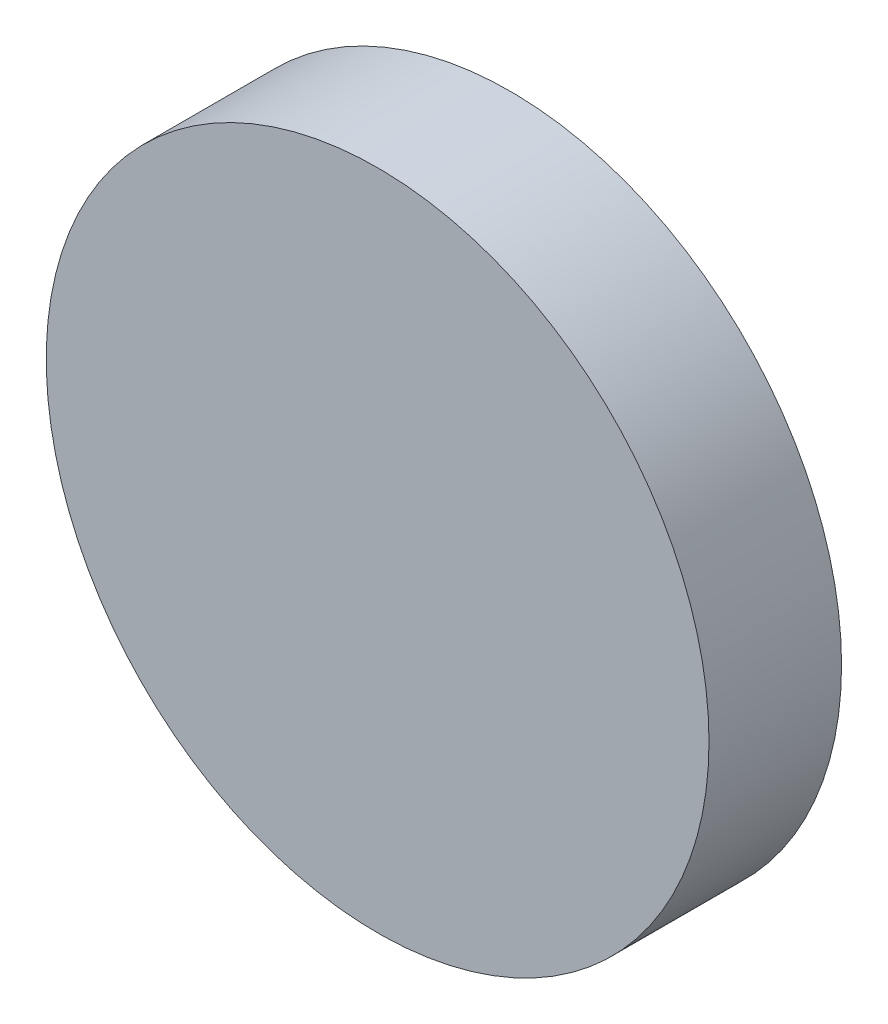
ISO-10303-21;
HEADER;
FILE_DESCRIPTION(('STEP AP214'),'2;1');
FILE_NAME('part.step','',(''),(''),'','','');
FILE_SCHEMA(('AUTOMOTIVE_DESIGN { 1 0 10303 214 1 1 1 1 }'));
ENDSEC;
DATA;
#1=APPLICATION_CONTEXT('core data for automotive mechanical design processes');
#2=APPLICATION_PROTOCOL_DEFINITION('international standard','automotive_design',2000,#1);
#3=PRODUCT_CONTEXT('',#1,'mechanical');
#4=PRODUCT('Part','Part','',(#3));
#5=PRODUCT_RELATED_PRODUCT_CATEGORY('part','',(#4));
#6=PRODUCT_DEFINITION_FORMATION('','',#4);
#7=PRODUCT_DEFINITION_CONTEXT('part definition',#1,'design');
#8=PRODUCT_DEFINITION('design','',#6,#7);
#9=PRODUCT_DEFINITION_SHAPE('','',#8);
#10=(LENGTH_UNIT() NAMED_UNIT(*) SI_UNIT(.MILLI.,.METRE.));
#11=(NAMED_UNIT(*) PLANE_ANGLE_UNIT() SI_UNIT($,.RADIAN.));
#12=(NAMED_UNIT(*) SI_UNIT($,.STERADIAN.) SOLID_ANGLE_UNIT());
#13=UNCERTAINTY_MEASURE_WITH_UNIT(LENGTH_MEASURE(1.E-05),#10,'distance_accuracy_value','');
#14=(GEOMETRIC_REPRESENTATION_CONTEXT(3) GLOBAL_UNCERTAINTY_ASSIGNED_CONTEXT((#13)) GLOBAL_UNIT_ASSIGNED_CONTEXT((#10,
#11,#12)) REPRESENTATION_CONTEXT('',''));
#15=CARTESIAN_POINT('',(0.,0.,0.));
#16=DIRECTION('',(0.,0.,1.));
#17=DIRECTION('',(1.,0.,0.));
#18=AXIS2_PLACEMENT_3D('',#15,#16,#17);
#19=CARTESIAN_POINT('',(0.,0.,20.));
#20=DIRECTION('',(0.,0.,-1.));
#21=DIRECTION('',(-1.,0.,0.));
#22=AXIS2_PLACEMENT_3D('',#19,#20,#21);
#23=CYLINDRICAL_SURFACE('',#22,50.);
#24=CARTESIAN_POINT('',(0.,0.,20.));
#25=DIRECTION('',(0.,0.,1.));
#26=DIRECTION('',(1.,0.,0.));
#27=AXIS2_PLACEMENT_3D('',#24,#25,#26);
#28=CIRCLE('',#27,50.);
#29=CARTESIAN_POINT('',(50.,0.,20.));
#30=VERTEX_POINT('',#29);
#31=EDGE_CURVE('E10',#30,#30,#28,.T.);
#32=ORIENTED_EDGE('',*,*,#31,.F.);
#33=EDGE_LOOP('',(#32));
#34=FACE_BOUND('',#33,.T.);
#35=CARTESIAN_POINT('',(0.,0.,0.));
#36=DIRECTION('',(0.,0.,1.));
#37=DIRECTION('',(1.,0.,0.));
#38=AXIS2_PLACEMENT_3D('',#35,#36,#37);
#39=CIRCLE('',#38,50.);
#40=CARTESIAN_POINT('',(50.,0.,0.));
#41=VERTEX_POINT('',#40);
#42=EDGE_CURVE('E34',#41,#41,#39,.T.);
#43=ORIENTED_EDGE('',*,*,#42,.T.);
#44=EDGE_LOOP('',(#43));
#45=FACE_BOUND('',#44,.T.);
#46=ADVANCED_FACE('F31',(#34,#45),#23,.T.);
#47=CARTESIAN_POINT('',(0.,0.,20.));
#48=DIRECTION('',(0.,0.,1.));
#49=DIRECTION('',(1.,0.,0.));
#50=AXIS2_PLACEMENT_3D('',#47,#48,#49);
#51=PLANE('',#50);
#52=ORIENTED_EDGE('',*,*,#31,.T.);
#53=EDGE_LOOP('',(#52));
#54=FACE_BOUND('',#53,.T.);
#55=ADVANCED_FACE('F46',(#54),#51,.T.);
#56=CARTESIAN_POINT('',(0.,0.,0.));
#57=DIRECTION('',(0.,0.,1.));
#58=DIRECTION('',(1.,0.,0.));
#59=AXIS2_PLACEMENT_3D('',#56,#57,#58);
#60=PLANE('',#59);
#61=ORIENTED_EDGE('',*,*,#42,.F.);
#62=EDGE_LOOP('',(#61));
#63=FACE_BOUND('',#62,.T.);
#64=ADVANCED_FACE('F44',(#63),#60,.F.);
#65=CLOSED_SHELL('',(#46,#55,#64));
#66=MANIFOLD_SOLID_BREP('B2',#65);
#67=ADVANCED_BREP_SHAPE_REPRESENTATION('',(#18,#66),#14);
#68=SHAPE_DEFINITION_REPRESENTATION(#9,#67);
ENDSEC;
END-ISO-10303-21;
